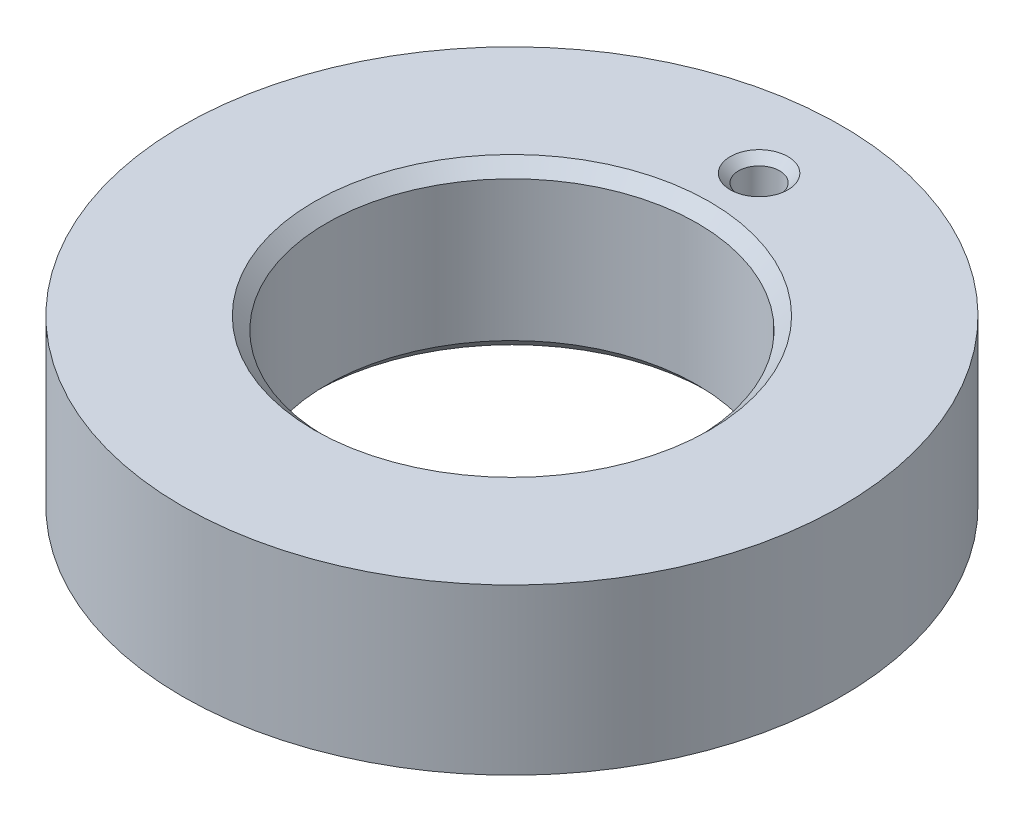
ISO-10303-21;
HEADER;
FILE_DESCRIPTION(('STEP AP214'),'2;1');
FILE_NAME('part.step','',(''),(''),'','','');
FILE_SCHEMA(('AUTOMOTIVE_DESIGN { 1 0 10303 214 1 1 1 1 }'));
ENDSEC;
DATA;
#1=APPLICATION_CONTEXT('core data for automotive mechanical design processes');
#2=APPLICATION_PROTOCOL_DEFINITION('international standard','automotive_design',2000,#1);
#3=PRODUCT_CONTEXT('',#1,'mechanical');
#4=PRODUCT('Part','Part','',(#3));
#5=PRODUCT_RELATED_PRODUCT_CATEGORY('part','',(#4));
#6=PRODUCT_DEFINITION_FORMATION('','',#4);
#7=PRODUCT_DEFINITION_CONTEXT('part definition',#1,'design');
#8=PRODUCT_DEFINITION('design','',#6,#7);
#9=PRODUCT_DEFINITION_SHAPE('','',#8);
#10=(LENGTH_UNIT() NAMED_UNIT(*) SI_UNIT(.MILLI.,.METRE.));
#11=(NAMED_UNIT(*) PLANE_ANGLE_UNIT() SI_UNIT($,.RADIAN.));
#12=(NAMED_UNIT(*) SI_UNIT($,.STERADIAN.) SOLID_ANGLE_UNIT());
#13=UNCERTAINTY_MEASURE_WITH_UNIT(LENGTH_MEASURE(1.E-05),#10,'distance_accuracy_value','');
#14=(GEOMETRIC_REPRESENTATION_CONTEXT(3) GLOBAL_UNCERTAINTY_ASSIGNED_CONTEXT((#13)) GLOBAL_UNIT_ASSIGNED_CONTEXT((#10,
#11,#12)) REPRESENTATION_CONTEXT('',''));
#15=CARTESIAN_POINT('',(0.,0.,0.));
#16=DIRECTION('',(0.,0.,1.));
#17=DIRECTION('',(1.,0.,0.));
#18=AXIS2_PLACEMENT_3D('',#15,#16,#17);
#19=CARTESIAN_POINT('',(0.,20.,0.));
#20=DIRECTION('',(0.,-1.,0.));
#21=DIRECTION('',(0.,0.,-1.));
#22=AXIS2_PLACEMENT_3D('',#19,#20,#21);
#23=CYLINDRICAL_SURFACE('',#22,40.);
#24=CARTESIAN_POINT('',(0.,20.,0.));
#25=DIRECTION('',(0.,1.,0.));
#26=DIRECTION('',(0.,0.,1.));
#27=AXIS2_PLACEMENT_3D('',#24,#25,#26);
#28=CIRCLE('',#27,40.);
#29=CARTESIAN_POINT('',(0.,20.,40.));
#30=VERTEX_POINT('',#29);
#31=EDGE_CURVE('E64',#30,#30,#28,.T.);
#32=ORIENTED_EDGE('',*,*,#31,.F.);
#33=EDGE_LOOP('',(#32));
#34=FACE_BOUND('',#33,.T.);
#35=CARTESIAN_POINT('',(0.,0.,0.));
#36=DIRECTION('',(0.,1.,0.));
#37=DIRECTION('',(0.,0.,1.));
#38=AXIS2_PLACEMENT_3D('',#35,#36,#37);
#39=CIRCLE('',#38,40.);
#40=CARTESIAN_POINT('',(0.,0.,40.));
#41=VERTEX_POINT('',#40);
#42=EDGE_CURVE('E65',#41,#41,#39,.T.);
#43=ORIENTED_EDGE('',*,*,#42,.T.);
#44=EDGE_LOOP('',(#43));
#45=FACE_BOUND('',#44,.T.);
#46=ADVANCED_FACE('F32',(#34,#45),#23,.T.);
#47=CARTESIAN_POINT('',(0.,20.,0.));
#48=DIRECTION('',(0.,1.,0.));
#49=DIRECTION('',(0.,0.,1.));
#50=AXIS2_PLACEMENT_3D('',#47,#48,#49);
#51=PLANE('',#50);
#52=CARTESIAN_POINT('',(0.,20.,-30.));
#53=DIRECTION('',(0.,1.,0.));
#54=DIRECTION('',(0.,0.,1.));
#55=AXIS2_PLACEMENT_3D('',#52,#53,#54);
#56=CIRCLE('',#55,3.49999999999999);
#57=CARTESIAN_POINT('',(0.,20.,-26.5));
#58=VERTEX_POINT('',#57);
#59=EDGE_CURVE('E47',#58,#58,#56,.F.);
#60=ORIENTED_EDGE('',*,*,#59,.T.);
#61=EDGE_LOOP('',(#60));
#62=FACE_BOUND('',#61,.T.);
#63=CARTESIAN_POINT('',(0.,20.,0.));
#64=DIRECTION('',(0.,1.,0.));
#65=DIRECTION('',(0.,0.,1.));
#66=AXIS2_PLACEMENT_3D('',#63,#64,#65);
#67=CIRCLE('',#66,24.);
#68=CARTESIAN_POINT('',(0.,20.,24.));
#69=VERTEX_POINT('',#68);
#70=EDGE_CURVE('E52',#69,#69,#67,.F.);
#71=ORIENTED_EDGE('',*,*,#70,.T.);
#72=EDGE_LOOP('',(#71));
#73=FACE_BOUND('',#72,.T.);
#74=ORIENTED_EDGE('',*,*,#31,.T.);
#75=EDGE_LOOP('',(#74));
#76=FACE_BOUND('',#75,.T.);
#77=ADVANCED_FACE('F71',(#62,#73,#76),#51,.T.);
#78=CARTESIAN_POINT('',(0.,0.,0.));
#79=DIRECTION('',(0.,1.,0.));
#80=DIRECTION('',(0.,0.,1.));
#81=AXIS2_PLACEMENT_3D('',#78,#79,#80);
#82=PLANE('',#81);
#83=CARTESIAN_POINT('',(0.,0.,-30.));
#84=DIRECTION('',(0.,1.,0.));
#85=DIRECTION('',(0.,0.,1.));
#86=AXIS2_PLACEMENT_3D('',#83,#84,#85);
#87=CIRCLE('',#86,3.49999999999999);
#88=CARTESIAN_POINT('',(0.,0.,-26.5));
#89=VERTEX_POINT('',#88);
#90=EDGE_CURVE('E10',#89,#89,#87,.T.);
#91=ORIENTED_EDGE('',*,*,#90,.T.);
#92=EDGE_LOOP('',(#91));
#93=FACE_BOUND('',#92,.T.);
#94=CARTESIAN_POINT('',(0.,0.,0.));
#95=DIRECTION('',(0.,1.,0.));
#96=DIRECTION('',(0.,0.,1.));
#97=AXIS2_PLACEMENT_3D('',#94,#95,#96);
#98=CIRCLE('',#97,24.);
#99=CARTESIAN_POINT('',(0.,0.,24.));
#100=VERTEX_POINT('',#99);
#101=EDGE_CURVE('E61',#100,#100,#98,.T.);
#102=ORIENTED_EDGE('',*,*,#101,.T.);
#103=EDGE_LOOP('',(#102));
#104=FACE_BOUND('',#103,.T.);
#105=ORIENTED_EDGE('',*,*,#42,.F.);
#106=EDGE_LOOP('',(#105));
#107=FACE_BOUND('',#106,.T.);
#108=ADVANCED_FACE('F78',(#93,#104,#107),#82,.F.);
#109=CARTESIAN_POINT('',(0.,0.,0.));
#110=DIRECTION('',(0.,1.,0.));
#111=DIRECTION('',(0.,0.,1.));
#112=AXIS2_PLACEMENT_3D('',#109,#110,#111);
#113=CYLINDRICAL_SURFACE('',#112,22.5);
#114=CARTESIAN_POINT('',(0.,1.49999999999999,0.));
#115=DIRECTION('',(0.,1.,0.));
#116=DIRECTION('',(0.,0.,1.));
#117=AXIS2_PLACEMENT_3D('',#114,#115,#116);
#118=CIRCLE('',#117,22.5);
#119=CARTESIAN_POINT('',(0.,1.49999999999999,22.5));
#120=VERTEX_POINT('',#119);
#121=EDGE_CURVE('E55',#120,#120,#118,.F.);
#122=ORIENTED_EDGE('',*,*,#121,.T.);
#123=EDGE_LOOP('',(#122));
#124=FACE_BOUND('',#123,.T.);
#125=CARTESIAN_POINT('',(0.,18.5,0.));
#126=DIRECTION('',(0.,1.,0.));
#127=DIRECTION('',(0.,0.,1.));
#128=AXIS2_PLACEMENT_3D('',#125,#126,#127);
#129=CIRCLE('',#128,22.5);
#130=CARTESIAN_POINT('',(0.,18.5,22.5));
#131=VERTEX_POINT('',#130);
#132=EDGE_CURVE('E58',#131,#131,#129,.T.);
#133=ORIENTED_EDGE('',*,*,#132,.T.);
#134=EDGE_LOOP('',(#133));
#135=FACE_BOUND('',#134,.T.);
#136=ADVANCED_FACE('F80',(#124,#135),#113,.F.);
#137=CARTESIAN_POINT('',(0.,0.,0.));
#138=DIRECTION('',(0.,-1.,0.));
#139=DIRECTION('',(0.,0.,-1.));
#140=AXIS2_PLACEMENT_3D('',#137,#138,#139);
#141=CONICAL_SURFACE('',#140,24.,0.785398163397443);
#142=ORIENTED_EDGE('',*,*,#121,.F.);
#143=EDGE_LOOP('',(#142));
#144=FACE_BOUND('',#143,.T.);
#145=ORIENTED_EDGE('',*,*,#101,.F.);
#146=EDGE_LOOP('',(#145));
#147=FACE_BOUND('',#146,.T.);
#148=ADVANCED_FACE('F86',(#144,#147),#141,.F.);
#149=CARTESIAN_POINT('',(0.,18.5,0.));
#150=DIRECTION('',(0.,1.,0.));
#151=DIRECTION('',(0.,0.,1.));
#152=AXIS2_PLACEMENT_3D('',#149,#150,#151);
#153=CONICAL_SURFACE('',#152,22.5,0.785398163397453);
#154=CARTESIAN_POINT('',(0.,20.,24.));
#155=CARTESIAN_POINT('',(0.,19.984375,23.984375));
#156=CARTESIAN_POINT('',(0.,19.96875,23.96875));
#157=CARTESIAN_POINT('',(0.,19.9375,23.9375));
#158=CARTESIAN_POINT('',(0.,19.921875,23.921875));
#159=CARTESIAN_POINT('',(0.,19.890625,23.890625));
#160=CARTESIAN_POINT('',(0.,19.875,23.875));
#161=CARTESIAN_POINT('',(0.,19.84375,23.84375));
#162=CARTESIAN_POINT('',(0.,19.828125,23.828125));
#163=CARTESIAN_POINT('',(0.,19.796875,23.796875));
#164=CARTESIAN_POINT('',(0.,19.78125,23.78125));
#165=CARTESIAN_POINT('',(0.,19.75,23.75));
#166=CARTESIAN_POINT('',(0.,19.734375,23.734375));
#167=CARTESIAN_POINT('',(0.,19.703125,23.703125));
#168=CARTESIAN_POINT('',(0.,19.6875,23.6875));
#169=CARTESIAN_POINT('',(0.,19.65625,23.65625));
#170=CARTESIAN_POINT('',(0.,19.640625,23.640625));
#171=CARTESIAN_POINT('',(0.,19.609375,23.609375));
#172=CARTESIAN_POINT('',(0.,19.59375,23.59375));
#173=CARTESIAN_POINT('',(0.,19.5625,23.5625));
#174=CARTESIAN_POINT('',(0.,19.546875,23.546875));
#175=CARTESIAN_POINT('',(0.,19.515625,23.515625));
#176=CARTESIAN_POINT('',(0.,19.5,23.5));
#177=CARTESIAN_POINT('',(0.,19.46875,23.46875));
#178=CARTESIAN_POINT('',(0.,19.453125,23.453125));
#179=CARTESIAN_POINT('',(0.,19.421875,23.421875));
#180=CARTESIAN_POINT('',(0.,19.40625,23.40625));
#181=CARTESIAN_POINT('',(0.,19.375,23.375));
#182=CARTESIAN_POINT('',(0.,19.359375,23.359375));
#183=CARTESIAN_POINT('',(0.,19.328125,23.328125));
#184=CARTESIAN_POINT('',(0.,19.3125,23.3125));
#185=CARTESIAN_POINT('',(0.,19.28125,23.28125));
#186=CARTESIAN_POINT('',(0.,19.265625,23.265625));
#187=CARTESIAN_POINT('',(0.,19.234375,23.234375));
#188=CARTESIAN_POINT('',(0.,19.21875,23.21875));
#189=CARTESIAN_POINT('',(0.,19.1875,23.1875));
#190=CARTESIAN_POINT('',(0.,19.171875,23.171875));
#191=CARTESIAN_POINT('',(0.,19.140625,23.140625));
#192=CARTESIAN_POINT('',(0.,19.125,23.125));
#193=CARTESIAN_POINT('',(0.,19.09375,23.09375));
#194=CARTESIAN_POINT('',(0.,19.078125,23.078125));
#195=CARTESIAN_POINT('',(0.,19.046875,23.046875));
#196=CARTESIAN_POINT('',(0.,19.03125,23.03125));
#197=CARTESIAN_POINT('',(0.,19.,23.));
#198=CARTESIAN_POINT('',(0.,18.984375,22.984375));
#199=CARTESIAN_POINT('',(0.,18.953125,22.953125));
#200=CARTESIAN_POINT('',(0.,18.9375,22.9375));
#201=CARTESIAN_POINT('',(0.,18.90625,22.90625));
#202=CARTESIAN_POINT('',(0.,18.890625,22.890625));
#203=CARTESIAN_POINT('',(0.,18.859375,22.859375));
#204=CARTESIAN_POINT('',(0.,18.84375,22.84375));
#205=CARTESIAN_POINT('',(0.,18.8125,22.8125));
#206=CARTESIAN_POINT('',(0.,18.796875,22.796875));
#207=CARTESIAN_POINT('',(0.,18.765625,22.765625));
#208=CARTESIAN_POINT('',(0.,18.75,22.75));
#209=CARTESIAN_POINT('',(0.,18.71875,22.71875));
#210=CARTESIAN_POINT('',(0.,18.703125,22.703125));
#211=CARTESIAN_POINT('',(0.,18.671875,22.671875));
#212=CARTESIAN_POINT('',(0.,18.65625,22.65625));
#213=CARTESIAN_POINT('',(0.,18.625,22.625));
#214=CARTESIAN_POINT('',(0.,18.609375,22.609375));
#215=CARTESIAN_POINT('',(0.,18.578125,22.578125));
#216=CARTESIAN_POINT('',(0.,18.5625,22.5625));
#217=CARTESIAN_POINT('',(0.,18.53125,22.53125));
#218=CARTESIAN_POINT('',(0.,18.515625,22.515625));
#219=CARTESIAN_POINT('',(0.,18.5,22.5));
#220=B_SPLINE_CURVE_WITH_KNOTS('',3,(#154,#155,#156,#157,#158,#159,#160,#161,#162,#163,#164,
#165,#166,#167,#168,#169,#170,#171,#172,#173,#174,#175,#176,#177,#178,#179,#180,#181,#182,#183,
#184,#185,#186,#187,#188,#189,#190,#191,#192,#193,#194,#195,#196,#197,#198,#199,#200,#201,#202,
#203,#204,#205,#206,#207,#208,#209,#210,#211,#212,#213,#214,#215,#216,#217,#218,#219),
.UNSPECIFIED.,.F.,.F.,(4,2,2,2,2,2,2,2,2,2,2,2,2,2,2,2,2,2,2,2,2,2,2,2,2,2,2,2,2,2,2,2,4),(0.,
0.0662912607362389,0.13258252147248,0.198873782208719,0.265165042944958,0.331456303681199,
0.397747564417438,0.464038825153677,0.530330085889916,0.596621346626157,0.662912607362396,
0.729203868098635,0.795495128834877,0.861786389571116,0.928077650307357,0.994368911043593,
1.06066017177983,1.12695143251608,1.19324269325231,1.25953395398855,1.32582521472479,
1.39211647546103,1.45840773619727,1.52469899693351,1.59099025766975,1.65728151840599,
1.72357277914223,1.78986403987847,1.85615530061471,1.92244656135095,1.98873782208719,
2.05502908282343,2.12132034355967),.UNSPECIFIED.);
#221=EDGE_CURVE('BSEAM95',#69,#131,#220,.T.);
#222=ORIENTED_EDGE('',*,*,#70,.F.);
#223=ORIENTED_EDGE('',*,*,#132,.F.);
#224=ORIENTED_EDGE('',*,*,#221,.T.);
#225=ORIENTED_EDGE('',*,*,#221,.F.);
#226=EDGE_LOOP('',(#222,#224,#223,#225));
#227=FACE_BOUND('',#226,.T.);
#228=ADVANCED_FACE('F95',(#227),#153,.F.);
#229=CARTESIAN_POINT('',(0.,20.,-30.));
#230=DIRECTION('',(0.,-1.,0.));
#231=DIRECTION('',(0.,0.,-1.));
#232=AXIS2_PLACEMENT_3D('',#229,#230,#231);
#233=CYLINDRICAL_SURFACE('',#232,2.5);
#234=CARTESIAN_POINT('',(0.,19.,-30.));
#235=DIRECTION('',(0.,1.,0.));
#236=DIRECTION('',(0.,0.,1.));
#237=AXIS2_PLACEMENT_3D('',#234,#235,#236);
#238=CIRCLE('',#237,2.5);
#239=CARTESIAN_POINT('',(0.,19.,-27.5));
#240=VERTEX_POINT('',#239);
#241=EDGE_CURVE('E39',#240,#240,#238,.T.);
#242=ORIENTED_EDGE('',*,*,#241,.T.);
#243=EDGE_LOOP('',(#242));
#244=FACE_BOUND('',#243,.T.);
#245=CARTESIAN_POINT('',(0.,0.999999999999984,-30.));
#246=DIRECTION('',(0.,1.,0.));
#247=DIRECTION('',(0.,0.,1.));
#248=AXIS2_PLACEMENT_3D('',#245,#246,#247);
#249=CIRCLE('',#248,2.5);
#250=CARTESIAN_POINT('',(0.,0.999999999999984,-27.5));
#251=VERTEX_POINT('',#250);
#252=EDGE_CURVE('E43',#251,#251,#249,.F.);
#253=ORIENTED_EDGE('',*,*,#252,.T.);
#254=EDGE_LOOP('',(#253));
#255=FACE_BOUND('',#254,.T.);
#256=ADVANCED_FACE('F98',(#244,#255),#233,.F.);
#257=CARTESIAN_POINT('',(0.,20.,-30.));
#258=DIRECTION('',(0.,1.,0.));
#259=DIRECTION('',(0.,0.,1.));
#260=AXIS2_PLACEMENT_3D('',#257,#258,#259);
#261=CONICAL_SURFACE('',#260,3.49999999999999,0.785398163397446);
#262=ORIENTED_EDGE('',*,*,#241,.F.);
#263=EDGE_LOOP('',(#262));
#264=FACE_BOUND('',#263,.T.);
#265=ORIENTED_EDGE('',*,*,#59,.F.);
#266=EDGE_LOOP('',(#265));
#267=FACE_BOUND('',#266,.T.);
#268=ADVANCED_FACE('F100',(#264,#267),#261,.F.);
#269=CARTESIAN_POINT('',(0.,0.999999999999984,-30.));
#270=DIRECTION('',(0.,-1.,0.));
#271=DIRECTION('',(0.,0.,-1.));
#272=AXIS2_PLACEMENT_3D('',#269,#270,#271);
#273=CONICAL_SURFACE('',#272,2.5,0.785398163397451);
#274=ORIENTED_EDGE('',*,*,#90,.F.);
#275=EDGE_LOOP('',(#274));
#276=FACE_BOUND('',#275,.T.);
#277=ORIENTED_EDGE('',*,*,#252,.F.);
#278=EDGE_LOOP('',(#277));
#279=FACE_BOUND('',#278,.T.);
#280=ADVANCED_FACE('F34',(#276,#279),#273,.F.);
#281=CLOSED_SHELL('',(#46,#77,#108,#136,#148,#228,#256,#268,#280));
#282=MANIFOLD_SOLID_BREP('B2',#281);
#283=ADVANCED_BREP_SHAPE_REPRESENTATION('',(#18,#282),#14);
#284=SHAPE_DEFINITION_REPRESENTATION(#9,#283);
ENDSEC;
END-ISO-10303-21;
